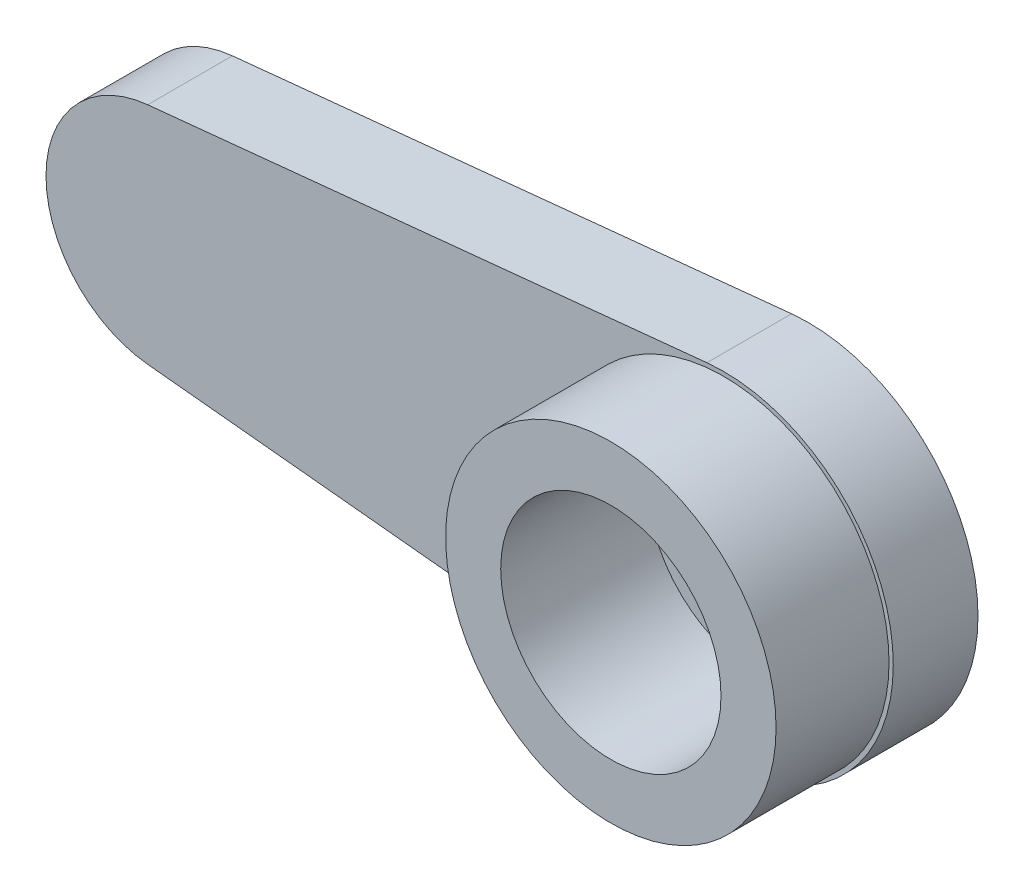
ISO-10303-21;
HEADER;
FILE_DESCRIPTION(('STEP AP214'),'2;1');
FILE_NAME('part.step','',(''),(''),'','','');
FILE_SCHEMA(('AUTOMOTIVE_DESIGN { 1 0 10303 214 1 1 1 1 }'));
ENDSEC;
DATA;
#1=APPLICATION_CONTEXT('core data for automotive mechanical design processes');
#2=APPLICATION_PROTOCOL_DEFINITION('international standard','automotive_design',2000,#1);
#3=PRODUCT_CONTEXT('',#1,'mechanical');
#4=PRODUCT('Part','Part','',(#3));
#5=PRODUCT_RELATED_PRODUCT_CATEGORY('part','',(#4));
#6=PRODUCT_DEFINITION_FORMATION('','',#4);
#7=PRODUCT_DEFINITION_CONTEXT('part definition',#1,'design');
#8=PRODUCT_DEFINITION('design','',#6,#7);
#9=PRODUCT_DEFINITION_SHAPE('','',#8);
#10=(LENGTH_UNIT() NAMED_UNIT(*) SI_UNIT(.MILLI.,.METRE.));
#11=(NAMED_UNIT(*) PLANE_ANGLE_UNIT() SI_UNIT($,.RADIAN.));
#12=(NAMED_UNIT(*) SI_UNIT($,.STERADIAN.) SOLID_ANGLE_UNIT());
#13=UNCERTAINTY_MEASURE_WITH_UNIT(LENGTH_MEASURE(1.E-05),#10,'distance_accuracy_value','');
#14=(GEOMETRIC_REPRESENTATION_CONTEXT(3) GLOBAL_UNCERTAINTY_ASSIGNED_CONTEXT((#13)) GLOBAL_UNIT_ASSIGNED_CONTEXT((#10,
#11,#12)) REPRESENTATION_CONTEXT('',''));
#15=CARTESIAN_POINT('',(0.,0.,0.));
#16=DIRECTION('',(0.,0.,1.));
#17=DIRECTION('',(1.,0.,0.));
#18=AXIS2_PLACEMENT_3D('',#15,#16,#17);
#19=CARTESIAN_POINT('',(5.02334590898628,0.,0.));
#20=DIRECTION('',(0.,0.,1.));
#21=DIRECTION('',(1.,0.,0.));
#22=AXIS2_PLACEMENT_3D('',#19,#20,#21);
#23=CYLINDRICAL_SURFACE('',#22,0.899999999999999);
#24=CARTESIAN_POINT('',(5.02334590898628,0.,0.));
#25=DIRECTION('',(0.,0.,1.));
#26=DIRECTION('',(1.,0.,0.));
#27=AXIS2_PLACEMENT_3D('',#24,#25,#26);
#28=CIRCLE('',#27,0.899999999999999);
#29=CARTESIAN_POINT('',(5.92334590898628,0.,0.));
#30=VERTEX_POINT('',#29);
#31=EDGE_CURVE('E115',#30,#30,#28,.T.);
#32=ORIENTED_EDGE('',*,*,#31,.F.);
#33=EDGE_LOOP('',(#32));
#34=FACE_BOUND('',#33,.T.);
#35=CARTESIAN_POINT('',(5.02334590898628,0.,0.9));
#36=DIRECTION('',(0.,0.,1.));
#37=DIRECTION('',(1.,0.,0.));
#38=AXIS2_PLACEMENT_3D('',#35,#36,#37);
#39=CIRCLE('',#38,0.899999999999999);
#40=CARTESIAN_POINT('',(5.92334590898628,0.,0.9));
#41=VERTEX_POINT('',#40);
#42=EDGE_CURVE('E35',#41,#41,#39,.F.);
#43=ORIENTED_EDGE('',*,*,#42,.F.);
#44=EDGE_LOOP('',(#43));
#45=FACE_BOUND('',#44,.T.);
#46=ADVANCED_FACE('F31',(#34,#45),#23,.F.);
#47=CARTESIAN_POINT('',(-4.97665409101372,0.,1.5));
#48=DIRECTION('',(0.,0.,1.));
#49=DIRECTION('',(1.,0.,0.));
#50=AXIS2_PLACEMENT_3D('',#47,#48,#49);
#51=PLANE('',#50);
#52=CARTESIAN_POINT('',(-4.97665409101372,0.,1.5));
#53=DIRECTION('',(0.,0.,1.));
#54=DIRECTION('',(1.,0.,0.));
#55=AXIS2_PLACEMENT_3D('',#52,#53,#54);
#56=CIRCLE('',#55,2.);
#57=CARTESIAN_POINT('',(-5.17665409101372,1.98997487421324,1.5));
#58=VERTEX_POINT('',#57);
#59=CARTESIAN_POINT('',(-5.17665409101372,-1.98997487421324,1.5));
#60=VERTEX_POINT('',#59);
#61=EDGE_CURVE('E85',#58,#60,#56,.T.);
#62=ORIENTED_EDGE('',*,*,#61,.T.);
#63=DIRECTION('',(0.99498743710662,-0.1,0.));
#64=VECTOR('',#63,1.);
#65=CARTESIAN_POINT('',(-5.17665409101372,-1.98997487421324,1.5));
#66=LINE('',#65,#64);
#67=CARTESIAN_POINT('',(4.72334590898628,-2.98496231131986,1.5));
#68=VERTEX_POINT('',#67);
#69=EDGE_CURVE('E79',#60,#68,#66,.T.);
#70=ORIENTED_EDGE('',*,*,#69,.T.);
#71=CARTESIAN_POINT('',(5.02334590898628,0.,1.5));
#72=DIRECTION('',(0.,0.,1.));
#73=DIRECTION('',(1.,0.,0.));
#74=AXIS2_PLACEMENT_3D('',#71,#72,#73);
#75=CIRCLE('',#74,3.);
#76=CARTESIAN_POINT('',(4.72334590898628,2.98496231131986,1.5));
#77=VERTEX_POINT('',#76);
#78=EDGE_CURVE('E83',#68,#77,#75,.T.);
#79=ORIENTED_EDGE('',*,*,#78,.T.);
#80=DIRECTION('',(-0.99498743710662,-0.1,0.));
#81=VECTOR('',#80,1.);
#82=CARTESIAN_POINT('',(-5.17665409101372,1.98997487421324,1.5));
#83=LINE('',#82,#81);
#84=EDGE_CURVE('E49',#77,#58,#83,.T.);
#85=ORIENTED_EDGE('',*,*,#84,.T.);
#86=EDGE_LOOP('',(#62,#70,#79,#85));
#87=FACE_BOUND('',#86,.T.);
#88=CARTESIAN_POINT('',(5.02334590898628,0.,1.5));
#89=DIRECTION('',(0.,0.,1.));
#90=DIRECTION('',(1.,0.,0.));
#91=AXIS2_PLACEMENT_3D('',#88,#89,#90);
#92=CIRCLE('',#91,2.925);
#93=CARTESIAN_POINT('',(7.94834590898628,0.,1.5));
#94=VERTEX_POINT('',#93);
#95=EDGE_CURVE('E112',#94,#94,#92,.T.);
#96=ORIENTED_EDGE('',*,*,#95,.F.);
#97=EDGE_LOOP('',(#96));
#98=FACE_BOUND('',#97,.T.);
#99=ADVANCED_FACE('F80',(#87,#98),#51,.T.);
#100=CARTESIAN_POINT('',(-4.97665409101372,0.,1.5));
#101=DIRECTION('',(0.,0.,-1.));
#102=DIRECTION('',(-1.,0.,0.));
#103=AXIS2_PLACEMENT_3D('',#100,#101,#102);
#104=CYLINDRICAL_SURFACE('',#103,2.);
#105=CARTESIAN_POINT('',(-4.97665409101372,0.,0.));
#106=DIRECTION('',(0.,0.,1.));
#107=DIRECTION('',(1.,0.,0.));
#108=AXIS2_PLACEMENT_3D('',#105,#106,#107);
#109=CIRCLE('',#108,2.);
#110=CARTESIAN_POINT('',(-5.17665409101372,1.98997487421324,0.));
#111=VERTEX_POINT('',#110);
#112=CARTESIAN_POINT('',(-5.17665409101372,-1.98997487421324,0.));
#113=VERTEX_POINT('',#112);
#114=EDGE_CURVE('E98',#111,#113,#109,.T.);
#115=ORIENTED_EDGE('',*,*,#114,.T.);
#116=DIRECTION('',(0.,0.,-1.));
#117=VECTOR('',#116,1.);
#118=CARTESIAN_POINT('',(-5.17665409101372,-1.98997487421324,1.5));
#119=LINE('',#118,#117);
#120=EDGE_CURVE('E11',#60,#113,#119,.T.);
#121=ORIENTED_EDGE('',*,*,#120,.F.);
#122=ORIENTED_EDGE('',*,*,#61,.F.);
#123=DIRECTION('',(0.,0.,-1.));
#124=VECTOR('',#123,1.);
#125=CARTESIAN_POINT('',(-5.17665409101372,1.98997487421324,1.5));
#126=LINE('',#125,#124);
#127=EDGE_CURVE('E94',#58,#111,#126,.T.);
#128=ORIENTED_EDGE('',*,*,#127,.T.);
#129=EDGE_LOOP('',(#115,#121,#122,#128));
#130=FACE_BOUND('',#129,.T.);
#131=ADVANCED_FACE('F33',(#130),#104,.T.);
#132=CARTESIAN_POINT('',(-5.17665409101372,-1.98997487421324,1.5));
#133=DIRECTION('',(0.1,0.99498743710662,0.));
#134=DIRECTION('',(-0.99498743710662,0.1,0.));
#135=AXIS2_PLACEMENT_3D('',#132,#133,#134);
#136=PLANE('',#135);
#137=DIRECTION('',(0.99498743710662,-0.1,0.));
#138=VECTOR('',#137,1.);
#139=CARTESIAN_POINT('',(-5.17665409101372,-1.98997487421324,0.));
#140=LINE('',#139,#138);
#141=CARTESIAN_POINT('',(4.72334590898628,-2.98496231131986,0.));
#142=VERTEX_POINT('',#141);
#143=EDGE_CURVE('E89',#113,#142,#140,.T.);
#144=ORIENTED_EDGE('',*,*,#143,.T.);
#145=DIRECTION('',(0.,0.,-1.));
#146=VECTOR('',#145,1.);
#147=CARTESIAN_POINT('',(4.72334590898628,-2.98496231131986,1.5));
#148=LINE('',#147,#146);
#149=EDGE_CURVE('E41',#68,#142,#148,.T.);
#150=ORIENTED_EDGE('',*,*,#149,.F.);
#151=ORIENTED_EDGE('',*,*,#69,.F.);
#152=ORIENTED_EDGE('',*,*,#120,.T.);
#153=EDGE_LOOP('',(#144,#150,#151,#152));
#154=FACE_BOUND('',#153,.T.);
#155=ADVANCED_FACE('F88',(#154),#136,.F.);
#156=CARTESIAN_POINT('',(5.02334590898628,0.,1.5));
#157=DIRECTION('',(0.,0.,-1.));
#158=DIRECTION('',(-1.,0.,0.));
#159=AXIS2_PLACEMENT_3D('',#156,#157,#158);
#160=CYLINDRICAL_SURFACE('',#159,3.);
#161=CARTESIAN_POINT('',(5.02334590898628,0.,0.));
#162=DIRECTION('',(0.,0.,1.));
#163=DIRECTION('',(1.,0.,0.));
#164=AXIS2_PLACEMENT_3D('',#161,#162,#163);
#165=CIRCLE('',#164,3.);
#166=CARTESIAN_POINT('',(4.72334590898628,2.98496231131986,0.));
#167=VERTEX_POINT('',#166);
#168=EDGE_CURVE('E66',#142,#167,#165,.T.);
#169=ORIENTED_EDGE('',*,*,#168,.T.);
#170=DIRECTION('',(0.,0.,-1.));
#171=VECTOR('',#170,1.);
#172=CARTESIAN_POINT('',(4.72334590898628,2.98496231131986,1.5));
#173=LINE('',#172,#171);
#174=EDGE_CURVE('E90',#77,#167,#173,.T.);
#175=ORIENTED_EDGE('',*,*,#174,.F.);
#176=ORIENTED_EDGE('',*,*,#78,.F.);
#177=ORIENTED_EDGE('',*,*,#149,.T.);
#178=EDGE_LOOP('',(#169,#175,#176,#177));
#179=FACE_BOUND('',#178,.T.);
#180=ADVANCED_FACE('F92',(#179),#160,.T.);
#181=CARTESIAN_POINT('',(-5.17665409101372,1.98997487421324,1.5));
#182=DIRECTION('',(0.1,-0.99498743710662,0.));
#183=DIRECTION('',(0.99498743710662,0.1,0.));
#184=AXIS2_PLACEMENT_3D('',#181,#182,#183);
#185=PLANE('',#184);
#186=DIRECTION('',(-0.99498743710662,-0.1,0.));
#187=VECTOR('',#186,1.);
#188=CARTESIAN_POINT('',(-5.17665409101372,1.98997487421324,0.));
#189=LINE('',#188,#187);
#190=EDGE_CURVE('E72',#167,#111,#189,.T.);
#191=ORIENTED_EDGE('',*,*,#190,.T.);
#192=ORIENTED_EDGE('',*,*,#127,.F.);
#193=ORIENTED_EDGE('',*,*,#84,.F.);
#194=ORIENTED_EDGE('',*,*,#174,.T.);
#195=EDGE_LOOP('',(#191,#192,#193,#194));
#196=FACE_BOUND('',#195,.T.);
#197=ADVANCED_FACE('F106',(#196),#185,.F.);
#198=CARTESIAN_POINT('',(-4.97665409101372,0.,0.));
#199=DIRECTION('',(0.,0.,1.));
#200=DIRECTION('',(1.,0.,0.));
#201=AXIS2_PLACEMENT_3D('',#198,#199,#200);
#202=PLANE('',#201);
#203=ORIENTED_EDGE('',*,*,#31,.T.);
#204=EDGE_LOOP('',(#203));
#205=FACE_BOUND('',#204,.T.);
#206=ORIENTED_EDGE('',*,*,#114,.F.);
#207=ORIENTED_EDGE('',*,*,#190,.F.);
#208=ORIENTED_EDGE('',*,*,#168,.F.);
#209=ORIENTED_EDGE('',*,*,#143,.F.);
#210=EDGE_LOOP('',(#206,#207,#208,#209));
#211=FACE_BOUND('',#210,.T.);
#212=ADVANCED_FACE('F109',(#205,#211),#202,.F.);
#213=CARTESIAN_POINT('',(5.02334590898628,0.,3.5));
#214=DIRECTION('',(0.,0.,-1.));
#215=DIRECTION('',(-1.,0.,0.));
#216=AXIS2_PLACEMENT_3D('',#213,#214,#215);
#217=CYLINDRICAL_SURFACE('',#216,2.925);
#218=CARTESIAN_POINT('',(5.02334590898628,0.,3.5));
#219=DIRECTION('',(0.,0.,1.));
#220=DIRECTION('',(1.,0.,0.));
#221=AXIS2_PLACEMENT_3D('',#218,#219,#220);
#222=CIRCLE('',#221,2.925);
#223=CARTESIAN_POINT('',(7.94834590898628,0.,3.5));
#224=VERTEX_POINT('',#223);
#225=EDGE_CURVE('E101',#224,#224,#222,.T.);
#226=ORIENTED_EDGE('',*,*,#225,.F.);
#227=EDGE_LOOP('',(#226));
#228=FACE_BOUND('',#227,.T.);
#229=ORIENTED_EDGE('',*,*,#95,.T.);
#230=EDGE_LOOP('',(#229));
#231=FACE_BOUND('',#230,.T.);
#232=ADVANCED_FACE('F147',(#228,#231),#217,.T.);
#233=CARTESIAN_POINT('',(5.02334590898628,0.,3.5));
#234=DIRECTION('',(0.,0.,1.));
#235=DIRECTION('',(1.,0.,0.));
#236=AXIS2_PLACEMENT_3D('',#233,#234,#235);
#237=PLANE('',#236);
#238=CARTESIAN_POINT('',(5.02334590898628,0.,3.5));
#239=DIRECTION('',(0.,0.,1.));
#240=DIRECTION('',(1.,0.,0.));
#241=AXIS2_PLACEMENT_3D('',#238,#239,#240);
#242=CIRCLE('',#241,1.95);
#243=CARTESIAN_POINT('',(6.97334590898628,0.,3.5));
#244=VERTEX_POINT('',#243);
#245=EDGE_CURVE('E120',#244,#244,#242,.T.);
#246=ORIENTED_EDGE('',*,*,#245,.F.);
#247=EDGE_LOOP('',(#246));
#248=FACE_BOUND('',#247,.T.);
#249=ORIENTED_EDGE('',*,*,#225,.T.);
#250=EDGE_LOOP('',(#249));
#251=FACE_BOUND('',#250,.T.);
#252=ADVANCED_FACE('F144',(#248,#251),#237,.T.);
#253=CARTESIAN_POINT('',(5.02334590898628,0.,0.9));
#254=DIRECTION('',(0.,0.,1.));
#255=DIRECTION('',(1.,0.,0.));
#256=AXIS2_PLACEMENT_3D('',#253,#254,#255);
#257=PLANE('',#256);
#258=CARTESIAN_POINT('',(5.02334590898628,0.,0.9));
#259=DIRECTION('',(0.,0.,1.));
#260=DIRECTION('',(1.,0.,0.));
#261=AXIS2_PLACEMENT_3D('',#258,#259,#260);
#262=CIRCLE('',#261,1.95);
#263=CARTESIAN_POINT('',(6.97334590898628,0.,0.9));
#264=VERTEX_POINT('',#263);
#265=EDGE_CURVE('E123',#264,#264,#262,.T.);
#266=ORIENTED_EDGE('',*,*,#265,.T.);
#267=EDGE_LOOP('',(#266));
#268=FACE_BOUND('',#267,.T.);
#269=ORIENTED_EDGE('',*,*,#42,.T.);
#270=EDGE_LOOP('',(#269));
#271=FACE_BOUND('',#270,.T.);
#272=ADVANCED_FACE('F130',(#268,#271),#257,.T.);
#273=CARTESIAN_POINT('',(5.02334590898628,0.,0.9));
#274=DIRECTION('',(0.,0.,1.));
#275=DIRECTION('',(1.,0.,0.));
#276=AXIS2_PLACEMENT_3D('',#273,#274,#275);
#277=CYLINDRICAL_SURFACE('',#276,1.95);
#278=ORIENTED_EDGE('',*,*,#265,.F.);
#279=EDGE_LOOP('',(#278));
#280=FACE_BOUND('',#279,.T.);
#281=ORIENTED_EDGE('',*,*,#245,.T.);
#282=EDGE_LOOP('',(#281));
#283=FACE_BOUND('',#282,.T.);
#284=ADVANCED_FACE('F142',(#280,#283),#277,.F.);
#285=CLOSED_SHELL('',(#46,#99,#131,#155,#180,#197,#212,#232,#252,#272,#284));
#286=MANIFOLD_SOLID_BREP('B2',#285);
#287=ADVANCED_BREP_SHAPE_REPRESENTATION('',(#18,#286),#14);
#288=SHAPE_DEFINITION_REPRESENTATION(#9,#287);
ENDSEC;
END-ISO-10303-21;
